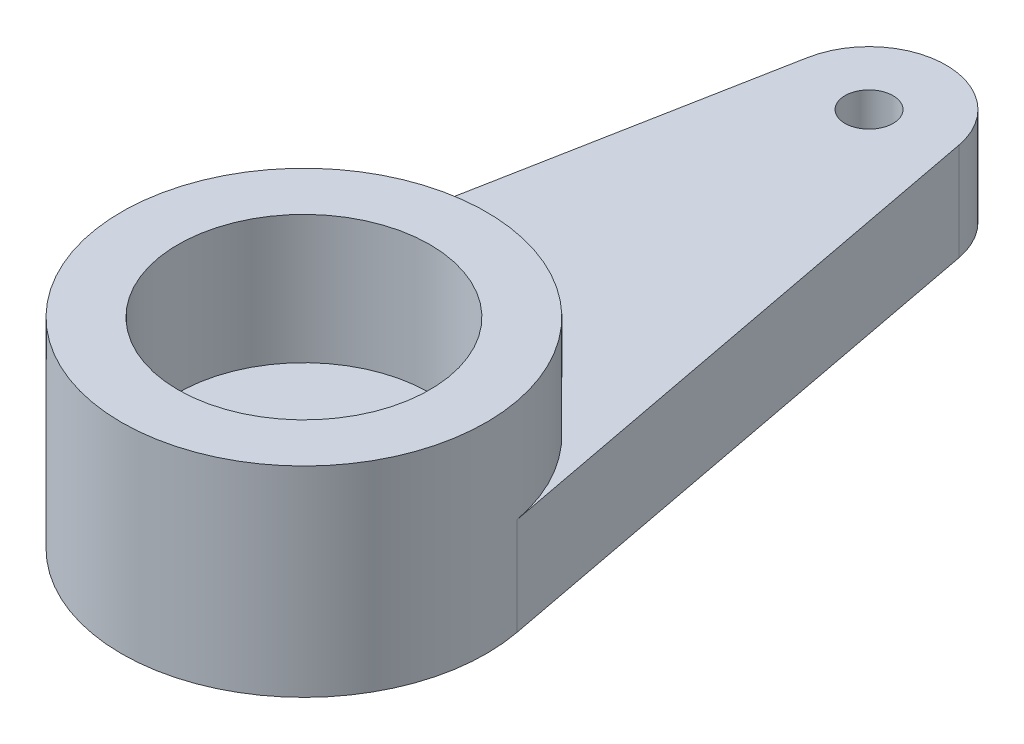
ISO-10303-21;
HEADER;
FILE_DESCRIPTION(('STEP AP214'),'2;1');
FILE_NAME('part.step','',(''),(''),'','','');
FILE_SCHEMA(('AUTOMOTIVE_DESIGN { 1 0 10303 214 1 1 1 1 }'));
ENDSEC;
DATA;
#1=APPLICATION_CONTEXT('core data for automotive mechanical design processes');
#2=APPLICATION_PROTOCOL_DEFINITION('international standard','automotive_design',2000,#1);
#3=PRODUCT_CONTEXT('',#1,'mechanical');
#4=PRODUCT('Part','Part','',(#3));
#5=PRODUCT_RELATED_PRODUCT_CATEGORY('part','',(#4));
#6=PRODUCT_DEFINITION_FORMATION('','',#4);
#7=PRODUCT_DEFINITION_CONTEXT('part definition',#1,'design');
#8=PRODUCT_DEFINITION('design','',#6,#7);
#9=PRODUCT_DEFINITION_SHAPE('','',#8);
#10=(LENGTH_UNIT() NAMED_UNIT(*) SI_UNIT(.MILLI.,.METRE.));
#11=(NAMED_UNIT(*) PLANE_ANGLE_UNIT() SI_UNIT($,.RADIAN.));
#12=(NAMED_UNIT(*) SI_UNIT($,.STERADIAN.) SOLID_ANGLE_UNIT());
#13=UNCERTAINTY_MEASURE_WITH_UNIT(LENGTH_MEASURE(1.E-05),#10,'distance_accuracy_value','');
#14=(GEOMETRIC_REPRESENTATION_CONTEXT(3) GLOBAL_UNCERTAINTY_ASSIGNED_CONTEXT((#13)) GLOBAL_UNIT_ASSIGNED_CONTEXT((#10,
#11,#12)) REPRESENTATION_CONTEXT('',''));
#15=CARTESIAN_POINT('',(0.,0.,0.));
#16=DIRECTION('',(0.,0.,1.));
#17=DIRECTION('',(1.,0.,0.));
#18=AXIS2_PLACEMENT_3D('',#15,#16,#17);
#19=CARTESIAN_POINT('',(0.,1.9,0.));
#20=DIRECTION('',(0.,-1.,0.));
#21=DIRECTION('',(0.,0.,-1.));
#22=AXIS2_PLACEMENT_3D('',#19,#20,#21);
#23=CYLINDRICAL_SURFACE('',#22,3.55);
#24=CARTESIAN_POINT('',(0.,0.,0.));
#25=DIRECTION('',(0.,1.,0.));
#26=DIRECTION('',(0.,0.,1.));
#27=AXIS2_PLACEMENT_3D('',#24,#25,#26);
#28=CIRCLE('',#27,3.55);
#29=CARTESIAN_POINT('',(-3.48780697129418,0.,-0.661590909090909));
#30=VERTEX_POINT('',#29);
#31=CARTESIAN_POINT('',(3.48780697129418,0.,-0.661590909090909));
#32=VERTEX_POINT('',#31);
#33=EDGE_CURVE('E100',#30,#32,#28,.T.);
#34=ORIENTED_EDGE('',*,*,#33,.T.);
#35=DIRECTION('',(0.,-1.,0.));
#36=VECTOR('',#35,1.);
#37=CARTESIAN_POINT('',(3.48780697129418,1.9,-0.661590909090909));
#38=LINE('',#37,#36);
#39=CARTESIAN_POINT('',(3.48780697129418,1.9,-0.661590909090909));
#40=VERTEX_POINT('',#39);
#41=EDGE_CURVE('E12',#40,#32,#38,.T.);
#42=ORIENTED_EDGE('',*,*,#41,.F.);
#43=CARTESIAN_POINT('',(0.,1.9,0.));
#44=DIRECTION('',(0.,1.,0.));
#45=DIRECTION('',(0.,0.,1.));
#46=AXIS2_PLACEMENT_3D('',#43,#44,#45);
#47=CIRCLE('',#46,3.55);
#48=CARTESIAN_POINT('',(-3.48780697129418,1.9,-0.661590909090909));
#49=VERTEX_POINT('',#48);
#50=EDGE_CURVE('E98',#40,#49,#47,.T.);
#51=ORIENTED_EDGE('',*,*,#50,.T.);
#52=DIRECTION('',(0.,-1.,0.));
#53=VECTOR('',#52,1.);
#54=CARTESIAN_POINT('',(-3.48780697129418,1.9,-0.661590909090909));
#55=LINE('',#54,#53);
#56=EDGE_CURVE('E118',#49,#30,#55,.T.);
#57=ORIENTED_EDGE('',*,*,#56,.T.);
#58=EDGE_LOOP('',(#34,#42,#51,#57));
#59=FACE_BOUND('',#58,.T.);
#60=CARTESIAN_POINT('',(0.,3.9,0.));
#61=DIRECTION('',(0.,1.,0.));
#62=DIRECTION('',(0.,0.,1.));
#63=AXIS2_PLACEMENT_3D('',#60,#61,#62);
#64=CIRCLE('',#63,3.55);
#65=CARTESIAN_POINT('',(0.,3.9,3.55));
#66=VERTEX_POINT('',#65);
#67=EDGE_CURVE('E107',#66,#66,#64,.T.);
#68=ORIENTED_EDGE('',*,*,#67,.F.);
#69=EDGE_LOOP('',(#68));
#70=FACE_BOUND('',#69,.T.);
#71=ADVANCED_FACE('F46',(#59,#70),#23,.T.);
#72=CARTESIAN_POINT('',(1.47372125547641,1.9,-11.2795454545455));
#73=DIRECTION('',(-0.982480836984275,0.,0.186363636363636));
#74=DIRECTION('',(0.186363636363636,0.,0.982480836984276));
#75=AXIS2_PLACEMENT_3D('',#72,#73,#74);
#76=PLANE('',#75);
#77=DIRECTION('',(-0.186363636363636,0.,-0.982480836984275));
#78=VECTOR('',#77,1.);
#79=CARTESIAN_POINT('',(1.47372125547641,0.,-11.2795454545455));
#80=LINE('',#79,#78);
#81=CARTESIAN_POINT('',(1.47372125547641,0.,-11.2795454545455));
#82=VERTEX_POINT('',#81);
#83=EDGE_CURVE('E120',#32,#82,#80,.T.);
#84=ORIENTED_EDGE('',*,*,#83,.T.);
#85=DIRECTION('',(0.,-1.,0.));
#86=VECTOR('',#85,1.);
#87=CARTESIAN_POINT('',(1.47372125547641,1.9,-11.2795454545455));
#88=LINE('',#87,#86);
#89=CARTESIAN_POINT('',(1.47372125547641,1.9,-11.2795454545455));
#90=VERTEX_POINT('',#89);
#91=EDGE_CURVE('E55',#90,#82,#88,.T.);
#92=ORIENTED_EDGE('',*,*,#91,.F.);
#93=DIRECTION('',(-0.186363636363636,0.,-0.982480836984275));
#94=VECTOR('',#93,1.);
#95=CARTESIAN_POINT('',(1.47372125547641,1.9,-11.2795454545455));
#96=LINE('',#95,#94);
#97=EDGE_CURVE('E90',#40,#90,#96,.T.);
#98=ORIENTED_EDGE('',*,*,#97,.F.);
#99=ORIENTED_EDGE('',*,*,#41,.T.);
#100=EDGE_LOOP('',(#84,#92,#98,#99));
#101=FACE_BOUND('',#100,.T.);
#102=ADVANCED_FACE('F102',(#101),#76,.F.);
#103=CARTESIAN_POINT('',(0.,1.9,-11.));
#104=DIRECTION('',(0.,-1.,0.));
#105=DIRECTION('',(0.,0.,-1.));
#106=AXIS2_PLACEMENT_3D('',#103,#104,#105);
#107=CYLINDRICAL_SURFACE('',#106,1.5);
#108=CARTESIAN_POINT('',(0.,0.,-11.));
#109=DIRECTION('',(0.,1.,0.));
#110=DIRECTION('',(0.,0.,-1.));
#111=AXIS2_PLACEMENT_3D('',#108,#109,#110);
#112=CIRCLE('',#111,1.5);
#113=CARTESIAN_POINT('',(-1.47372125547641,0.,-11.2795454545455));
#114=VERTEX_POINT('',#113);
#115=EDGE_CURVE('E81',#82,#114,#112,.T.);
#116=ORIENTED_EDGE('',*,*,#115,.T.);
#117=DIRECTION('',(0.,-1.,0.));
#118=VECTOR('',#117,1.);
#119=CARTESIAN_POINT('',(-1.47372125547641,1.9,-11.2795454545455));
#120=LINE('',#119,#118);
#121=CARTESIAN_POINT('',(-1.47372125547641,1.9,-11.2795454545455));
#122=VERTEX_POINT('',#121);
#123=EDGE_CURVE('E125',#122,#114,#120,.T.);
#124=ORIENTED_EDGE('',*,*,#123,.F.);
#125=CARTESIAN_POINT('',(0.,1.9,-11.));
#126=DIRECTION('',(0.,1.,0.));
#127=DIRECTION('',(0.,0.,-1.));
#128=AXIS2_PLACEMENT_3D('',#125,#126,#127);
#129=CIRCLE('',#128,1.5);
#130=EDGE_CURVE('E104',#90,#122,#129,.T.);
#131=ORIENTED_EDGE('',*,*,#130,.F.);
#132=ORIENTED_EDGE('',*,*,#91,.T.);
#133=EDGE_LOOP('',(#116,#124,#131,#132));
#134=FACE_BOUND('',#133,.T.);
#135=ADVANCED_FACE('F127',(#134),#107,.T.);
#136=CARTESIAN_POINT('',(-3.48780697129418,1.9,-0.661590909090909));
#137=DIRECTION('',(0.982480836984275,0.,0.186363636363636));
#138=DIRECTION('',(0.186363636363636,0.,-0.982480836984276));
#139=AXIS2_PLACEMENT_3D('',#136,#137,#138);
#140=PLANE('',#139);
#141=DIRECTION('',(-0.186363636363636,0.,0.982480836984275));
#142=VECTOR('',#141,1.);
#143=CARTESIAN_POINT('',(-3.48780697129418,0.,-0.661590909090909));
#144=LINE('',#143,#142);
#145=EDGE_CURVE('E86',#114,#30,#144,.T.);
#146=ORIENTED_EDGE('',*,*,#145,.T.);
#147=ORIENTED_EDGE('',*,*,#56,.F.);
#148=DIRECTION('',(-0.186363636363636,0.,0.982480836984275));
#149=VECTOR('',#148,1.);
#150=CARTESIAN_POINT('',(-3.48780697129418,1.9,-0.661590909090909));
#151=LINE('',#150,#149);
#152=EDGE_CURVE('E63',#122,#49,#151,.T.);
#153=ORIENTED_EDGE('',*,*,#152,.F.);
#154=ORIENTED_EDGE('',*,*,#123,.T.);
#155=EDGE_LOOP('',(#146,#147,#153,#154));
#156=FACE_BOUND('',#155,.T.);
#157=ADVANCED_FACE('F141',(#156),#140,.F.);
#158=CARTESIAN_POINT('',(0.,1.9,0.));
#159=DIRECTION('',(0.,1.,0.));
#160=DIRECTION('',(0.,0.,1.));
#161=AXIS2_PLACEMENT_3D('',#158,#159,#160);
#162=PLANE('',#161);
#163=CARTESIAN_POINT('',(0.,1.9,-11.));
#164=DIRECTION('',(0.,1.,0.));
#165=DIRECTION('',(0.,0.,1.));
#166=AXIS2_PLACEMENT_3D('',#163,#164,#165);
#167=CIRCLE('',#166,0.468509015076391);
#168=CARTESIAN_POINT('',(0.,1.9,-10.5314909849236));
#169=VERTEX_POINT('',#168);
#170=EDGE_CURVE('E221',#169,#169,#167,.T.);
#171=ORIENTED_EDGE('',*,*,#170,.F.);
#172=EDGE_LOOP('',(#171));
#173=FACE_BOUND('',#172,.T.);
#174=ORIENTED_EDGE('',*,*,#50,.F.);
#175=ORIENTED_EDGE('',*,*,#97,.T.);
#176=ORIENTED_EDGE('',*,*,#130,.T.);
#177=ORIENTED_EDGE('',*,*,#152,.T.);
#178=EDGE_LOOP('',(#174,#175,#176,#177));
#179=FACE_BOUND('',#178,.T.);
#180=ADVANCED_FACE('F106',(#173,#179),#162,.T.);
#181=CARTESIAN_POINT('',(0.,0.,0.));
#182=DIRECTION('',(0.,1.,0.));
#183=DIRECTION('',(0.,0.,1.));
#184=AXIS2_PLACEMENT_3D('',#181,#182,#183);
#185=PLANE('',#184);
#186=CARTESIAN_POINT('',(0.,0.,-11.));
#187=DIRECTION('',(0.,1.,0.));
#188=DIRECTION('',(0.,0.,1.));
#189=AXIS2_PLACEMENT_3D('',#186,#187,#188);
#190=CIRCLE('',#189,0.468509015076391);
#191=CARTESIAN_POINT('',(0.,0.,-10.5314909849236));
#192=VERTEX_POINT('',#191);
#193=EDGE_CURVE('E228',#192,#192,#190,.T.);
#194=ORIENTED_EDGE('',*,*,#193,.T.);
#195=EDGE_LOOP('',(#194));
#196=FACE_BOUND('',#195,.T.);
#197=CARTESIAN_POINT('',(0.,0.,0.));
#198=DIRECTION('',(0.,1.,0.));
#199=DIRECTION('',(0.,0.,1.));
#200=AXIS2_PLACEMENT_3D('',#197,#198,#199);
#201=CIRCLE('',#200,0.881877007597757);
#202=CARTESIAN_POINT('',(0.,0.,0.881877007597757));
#203=VERTEX_POINT('',#202);
#204=EDGE_CURVE('E225',#203,#203,#201,.T.);
#205=ORIENTED_EDGE('',*,*,#204,.T.);
#206=EDGE_LOOP('',(#205));
#207=FACE_BOUND('',#206,.T.);
#208=ORIENTED_EDGE('',*,*,#33,.F.);
#209=ORIENTED_EDGE('',*,*,#145,.F.);
#210=ORIENTED_EDGE('',*,*,#115,.F.);
#211=ORIENTED_EDGE('',*,*,#83,.F.);
#212=EDGE_LOOP('',(#208,#209,#210,#211));
#213=FACE_BOUND('',#212,.T.);
#214=ADVANCED_FACE('F129',(#196,#207,#213),#185,.F.);
#215=CARTESIAN_POINT('',(0.,3.9,0.));
#216=DIRECTION('',(0.,1.,0.));
#217=DIRECTION('',(0.,0.,1.));
#218=AXIS2_PLACEMENT_3D('',#215,#216,#217);
#219=PLANE('',#218);
#220=ORIENTED_EDGE('',*,*,#67,.T.);
#221=EDGE_LOOP('',(#220));
#222=FACE_BOUND('',#221,.T.);
#223=CARTESIAN_POINT('',(0.,3.9,0.));
#224=DIRECTION('',(0.,1.,0.));
#225=DIRECTION('',(0.,0.,1.));
#226=AXIS2_PLACEMENT_3D('',#223,#224,#225);
#227=CIRCLE('',#226,2.45);
#228=CARTESIAN_POINT('',(0.,3.9,2.45));
#229=VERTEX_POINT('',#228);
#230=EDGE_CURVE('E108',#229,#229,#227,.T.);
#231=ORIENTED_EDGE('',*,*,#230,.F.);
#232=EDGE_LOOP('',(#231));
#233=FACE_BOUND('',#232,.T.);
#234=ADVANCED_FACE('F131',(#222,#233),#219,.T.);
#235=CARTESIAN_POINT('',(0.,3.9,0.));
#236=DIRECTION('',(0.,-1.,0.));
#237=DIRECTION('',(0.,0.,-1.));
#238=AXIS2_PLACEMENT_3D('',#235,#236,#237);
#239=CYLINDRICAL_SURFACE('',#238,2.45);
#240=ORIENTED_EDGE('',*,*,#230,.T.);
#241=EDGE_LOOP('',(#240));
#242=FACE_BOUND('',#241,.T.);
#243=CARTESIAN_POINT('',(0.,1.4,0.));
#244=DIRECTION('',(0.,1.,0.));
#245=DIRECTION('',(0.,0.,1.));
#246=AXIS2_PLACEMENT_3D('',#243,#244,#245);
#247=CIRCLE('',#246,2.45);
#248=CARTESIAN_POINT('',(0.,1.4,2.45));
#249=VERTEX_POINT('',#248);
#250=EDGE_CURVE('E113',#249,#249,#247,.T.);
#251=ORIENTED_EDGE('',*,*,#250,.F.);
#252=EDGE_LOOP('',(#251));
#253=FACE_BOUND('',#252,.T.);
#254=ADVANCED_FACE('F138',(#242,#253),#239,.F.);
#255=CARTESIAN_POINT('',(0.,1.4,0.));
#256=DIRECTION('',(0.,1.,0.));
#257=DIRECTION('',(0.,0.,1.));
#258=AXIS2_PLACEMENT_3D('',#255,#256,#257);
#259=PLANE('',#258);
#260=CARTESIAN_POINT('',(0.,1.4,0.));
#261=DIRECTION('',(0.,1.,0.));
#262=DIRECTION('',(0.,0.,1.));
#263=AXIS2_PLACEMENT_3D('',#260,#261,#262);
#264=CIRCLE('',#263,0.881877007597757);
#265=CARTESIAN_POINT('',(0.,1.4,0.881877007597757));
#266=VERTEX_POINT('',#265);
#267=EDGE_CURVE('E49',#266,#266,#264,.T.);
#268=ORIENTED_EDGE('',*,*,#267,.F.);
#269=EDGE_LOOP('',(#268));
#270=FACE_BOUND('',#269,.T.);
#271=ORIENTED_EDGE('',*,*,#250,.T.);
#272=EDGE_LOOP('',(#271));
#273=FACE_BOUND('',#272,.T.);
#274=ADVANCED_FACE('F179',(#270,#273),#259,.T.);
#275=CARTESIAN_POINT('',(0.,0.,0.));
#276=DIRECTION('',(0.,1.,0.));
#277=DIRECTION('',(0.,0.,1.));
#278=AXIS2_PLACEMENT_3D('',#275,#276,#277);
#279=CYLINDRICAL_SURFACE('',#278,0.881877007597757);
#280=ORIENTED_EDGE('',*,*,#267,.T.);
#281=EDGE_LOOP('',(#280));
#282=FACE_BOUND('',#281,.T.);
#283=ORIENTED_EDGE('',*,*,#204,.F.);
#284=EDGE_LOOP('',(#283));
#285=FACE_BOUND('',#284,.T.);
#286=ADVANCED_FACE('F184',(#282,#285),#279,.F.);
#287=CARTESIAN_POINT('',(0.,0.,-11.));
#288=DIRECTION('',(0.,1.,0.));
#289=DIRECTION('',(0.,0.,1.));
#290=AXIS2_PLACEMENT_3D('',#287,#288,#289);
#291=CYLINDRICAL_SURFACE('',#290,0.468509015076391);
#292=ORIENTED_EDGE('',*,*,#170,.T.);
#293=EDGE_LOOP('',(#292));
#294=FACE_BOUND('',#293,.T.);
#295=ORIENTED_EDGE('',*,*,#193,.F.);
#296=EDGE_LOOP('',(#295));
#297=FACE_BOUND('',#296,.T.);
#298=ADVANCED_FACE('F194',(#294,#297),#291,.F.);
#299=CLOSED_SHELL('',(#71,#102,#135,#157,#180,#214,#234,#254,#274,#286,#298));
#300=MANIFOLD_SOLID_BREP('B2',#299);
#301=ADVANCED_BREP_SHAPE_REPRESENTATION('',(#18,#300),#14);
#302=SHAPE_DEFINITION_REPRESENTATION(#9,#301);
ENDSEC;
END-ISO-10303-21;
